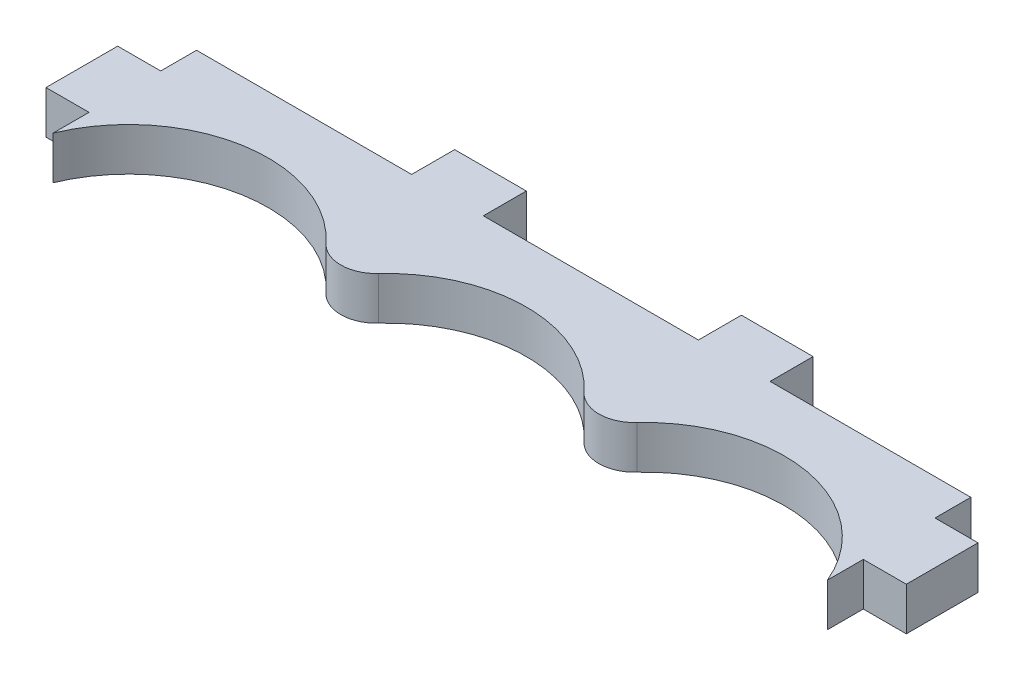
ISO-10303-21;
HEADER;
FILE_DESCRIPTION(('STEP AP214'),'2;1');
FILE_NAME('part.step','',(''),(''),'','','');
FILE_SCHEMA(('AUTOMOTIVE_DESIGN { 1 0 10303 214 1 1 1 1 }'));
ENDSEC;
DATA;
#1=APPLICATION_CONTEXT('core data for automotive mechanical design processes');
#2=APPLICATION_PROTOCOL_DEFINITION('international standard','automotive_design',2000,#1);
#3=PRODUCT_CONTEXT('',#1,'mechanical');
#4=PRODUCT('Part','Part','',(#3));
#5=PRODUCT_RELATED_PRODUCT_CATEGORY('part','',(#4));
#6=PRODUCT_DEFINITION_FORMATION('','',#4);
#7=PRODUCT_DEFINITION_CONTEXT('part definition',#1,'design');
#8=PRODUCT_DEFINITION('design','',#6,#7);
#9=PRODUCT_DEFINITION_SHAPE('','',#8);
#10=(LENGTH_UNIT() NAMED_UNIT(*) SI_UNIT(.MILLI.,.METRE.));
#11=(NAMED_UNIT(*) PLANE_ANGLE_UNIT() SI_UNIT($,.RADIAN.));
#12=(NAMED_UNIT(*) SI_UNIT($,.STERADIAN.) SOLID_ANGLE_UNIT());
#13=UNCERTAINTY_MEASURE_WITH_UNIT(LENGTH_MEASURE(1.E-05),#10,'distance_accuracy_value','');
#14=(GEOMETRIC_REPRESENTATION_CONTEXT(3) GLOBAL_UNCERTAINTY_ASSIGNED_CONTEXT((#13)) GLOBAL_UNIT_ASSIGNED_CONTEXT((#10,
#11,#12)) REPRESENTATION_CONTEXT('',''));
#15=CARTESIAN_POINT('',(0.,0.,0.));
#16=DIRECTION('',(0.,0.,1.));
#17=DIRECTION('',(1.,0.,0.));
#18=AXIS2_PLACEMENT_3D('',#15,#16,#17);
#19=CARTESIAN_POINT('',(0.,6.,0.));
#20=DIRECTION('',(1.,0.,0.));
#21=DIRECTION('',(0.,0.,-1.));
#22=AXIS2_PLACEMENT_3D('',#19,#20,#21);
#23=PLANE('',#22);
#24=DIRECTION('',(0.,0.,1.));
#25=VECTOR('',#24,1.);
#26=CARTESIAN_POINT('',(0.,0.,0.));
#27=LINE('',#26,#25);
#28=CARTESIAN_POINT('',(0.,0.,0.));
#29=VERTEX_POINT('',#28);
#30=CARTESIAN_POINT('',(0.,0.,5.));
#31=VERTEX_POINT('',#30);
#32=EDGE_CURVE('E219',#29,#31,#27,.T.);
#33=ORIENTED_EDGE('',*,*,#32,.T.);
#34=DIRECTION('',(0.,-1.,0.));
#35=VECTOR('',#34,1.);
#36=CARTESIAN_POINT('',(0.,6.,5.));
#37=LINE('',#36,#35);
#38=CARTESIAN_POINT('',(0.,6.,5.));
#39=VERTEX_POINT('',#38);
#40=EDGE_CURVE('E200',#39,#31,#37,.T.);
#41=ORIENTED_EDGE('',*,*,#40,.F.);
#42=DIRECTION('',(0.,0.,1.));
#43=VECTOR('',#42,1.);
#44=CARTESIAN_POINT('',(0.,6.,0.));
#45=LINE('',#44,#43);
#46=CARTESIAN_POINT('',(0.,6.,0.));
#47=VERTEX_POINT('',#46);
#48=EDGE_CURVE('E207',#47,#39,#45,.T.);
#49=ORIENTED_EDGE('',*,*,#48,.F.);
#50=DIRECTION('',(0.,-1.,0.));
#51=VECTOR('',#50,1.);
#52=CARTESIAN_POINT('',(0.,6.,0.));
#53=LINE('',#52,#51);
#54=EDGE_CURVE('E295',#47,#29,#53,.T.);
#55=ORIENTED_EDGE('',*,*,#54,.T.);
#56=EDGE_LOOP('',(#33,#41,#49,#55));
#57=FACE_BOUND('',#56,.T.);
#58=ADVANCED_FACE('F33',(#57),#23,.F.);
#59=CARTESIAN_POINT('',(0.,6.,5.));
#60=DIRECTION('',(0.,0.,1.));
#61=DIRECTION('',(1.,0.,0.));
#62=AXIS2_PLACEMENT_3D('',#59,#60,#61);
#63=PLANE('',#62);
#64=DIRECTION('',(-1.,0.,0.));
#65=VECTOR('',#64,1.);
#66=CARTESIAN_POINT('',(0.,0.,5.));
#67=LINE('',#66,#65);
#68=CARTESIAN_POINT('',(-6.00000000000001,0.,5.));
#69=VERTEX_POINT('',#68);
#70=EDGE_CURVE('E357',#31,#69,#67,.T.);
#71=ORIENTED_EDGE('',*,*,#70,.T.);
#72=DIRECTION('',(0.,-1.,0.));
#73=VECTOR('',#72,1.);
#74=CARTESIAN_POINT('',(-6.00000000000001,6.,5.));
#75=LINE('',#74,#73);
#76=CARTESIAN_POINT('',(-6.00000000000001,6.,5.));
#77=VERTEX_POINT('',#76);
#78=EDGE_CURVE('E203',#77,#69,#75,.T.);
#79=ORIENTED_EDGE('',*,*,#78,.F.);
#80=DIRECTION('',(-1.,0.,0.));
#81=VECTOR('',#80,1.);
#82=CARTESIAN_POINT('',(0.,6.,5.));
#83=LINE('',#82,#81);
#84=EDGE_CURVE('E196',#39,#77,#83,.T.);
#85=ORIENTED_EDGE('',*,*,#84,.F.);
#86=ORIENTED_EDGE('',*,*,#40,.T.);
#87=EDGE_LOOP('',(#71,#79,#85,#86));
#88=FACE_BOUND('',#87,.T.);
#89=ADVANCED_FACE('F198',(#88),#63,.F.);
#90=CARTESIAN_POINT('',(-6.00000000000001,6.,5.));
#91=DIRECTION('',(1.,0.,0.));
#92=DIRECTION('',(0.,0.,-1.));
#93=AXIS2_PLACEMENT_3D('',#90,#91,#92);
#94=PLANE('',#93);
#95=DIRECTION('',(0.,0.,1.));
#96=VECTOR('',#95,1.);
#97=CARTESIAN_POINT('',(-6.00000000000001,0.,5.));
#98=LINE('',#97,#96);
#99=CARTESIAN_POINT('',(-6.00000000000001,0.,15.));
#100=VERTEX_POINT('',#99);
#101=EDGE_CURVE('E354',#69,#100,#98,.T.);
#102=ORIENTED_EDGE('',*,*,#101,.T.);
#103=DIRECTION('',(0.,-1.,0.));
#104=VECTOR('',#103,1.);
#105=CARTESIAN_POINT('',(-6.00000000000001,6.,15.));
#106=LINE('',#105,#104);
#107=CARTESIAN_POINT('',(-6.00000000000001,6.,15.));
#108=VERTEX_POINT('',#107);
#109=EDGE_CURVE('E225',#108,#100,#106,.T.);
#110=ORIENTED_EDGE('',*,*,#109,.F.);
#111=DIRECTION('',(0.,0.,1.));
#112=VECTOR('',#111,1.);
#113=CARTESIAN_POINT('',(-6.00000000000001,6.,5.));
#114=LINE('',#113,#112);
#115=EDGE_CURVE('E206',#77,#108,#114,.T.);
#116=ORIENTED_EDGE('',*,*,#115,.F.);
#117=ORIENTED_EDGE('',*,*,#78,.T.);
#118=EDGE_LOOP('',(#102,#110,#116,#117));
#119=FACE_BOUND('',#118,.T.);
#120=ADVANCED_FACE('F394',(#119),#94,.F.);
#121=CARTESIAN_POINT('',(-6.00000000000001,6.,15.));
#122=DIRECTION('',(0.,0.,-1.));
#123=DIRECTION('',(-1.,0.,0.));
#124=AXIS2_PLACEMENT_3D('',#121,#122,#123);
#125=PLANE('',#124);
#126=DIRECTION('',(1.,0.,0.));
#127=VECTOR('',#126,1.);
#128=CARTESIAN_POINT('',(-6.00000000000001,0.,15.));
#129=LINE('',#128,#127);
#130=CARTESIAN_POINT('',(0.,0.,15.));
#131=VERTEX_POINT('',#130);
#132=EDGE_CURVE('E349',#100,#131,#129,.T.);
#133=ORIENTED_EDGE('',*,*,#132,.T.);
#134=DIRECTION('',(0.,-1.,0.));
#135=VECTOR('',#134,1.);
#136=CARTESIAN_POINT('',(0.,6.,15.));
#137=LINE('',#136,#135);
#138=CARTESIAN_POINT('',(0.,6.,15.));
#139=VERTEX_POINT('',#138);
#140=EDGE_CURVE('E340',#139,#131,#137,.T.);
#141=ORIENTED_EDGE('',*,*,#140,.F.);
#142=DIRECTION('',(1.,0.,0.));
#143=VECTOR('',#142,1.);
#144=CARTESIAN_POINT('',(-6.00000000000001,6.,15.));
#145=LINE('',#144,#143);
#146=EDGE_CURVE('E350',#108,#139,#145,.T.);
#147=ORIENTED_EDGE('',*,*,#146,.F.);
#148=ORIENTED_EDGE('',*,*,#109,.T.);
#149=EDGE_LOOP('',(#133,#141,#147,#148));
#150=FACE_BOUND('',#149,.T.);
#151=ADVANCED_FACE('F347',(#150),#125,.F.);
#152=CARTESIAN_POINT('',(0.,6.,15.));
#153=DIRECTION('',(1.,0.,0.));
#154=DIRECTION('',(0.,0.,-1.));
#155=AXIS2_PLACEMENT_3D('',#152,#153,#154);
#156=PLANE('',#155);
#157=DIRECTION('',(0.,0.,1.));
#158=VECTOR('',#157,1.);
#159=CARTESIAN_POINT('',(0.,0.,15.));
#160=LINE('',#159,#158);
#161=CARTESIAN_POINT('',(0.,0.,20.));
#162=VERTEX_POINT('',#161);
#163=EDGE_CURVE('E265',#131,#162,#160,.T.);
#164=ORIENTED_EDGE('',*,*,#163,.T.);
#165=DIRECTION('',(0.,-1.,0.));
#166=VECTOR('',#165,1.);
#167=CARTESIAN_POINT('',(0.,6.,20.));
#168=LINE('',#167,#166);
#169=CARTESIAN_POINT('',(0.,6.,20.));
#170=VERTEX_POINT('',#169);
#171=EDGE_CURVE('E337',#170,#162,#168,.T.);
#172=ORIENTED_EDGE('',*,*,#171,.F.);
#173=DIRECTION('',(0.,0.,1.));
#174=VECTOR('',#173,1.);
#175=CARTESIAN_POINT('',(0.,6.,15.));
#176=LINE('',#175,#174);
#177=EDGE_CURVE('E391',#139,#170,#176,.T.);
#178=ORIENTED_EDGE('',*,*,#177,.F.);
#179=ORIENTED_EDGE('',*,*,#140,.T.);
#180=EDGE_LOOP('',(#164,#172,#178,#179));
#181=FACE_BOUND('',#180,.T.);
#182=ADVANCED_FACE('F401',(#181),#156,.F.);
#183=CARTESIAN_POINT('',(18.,6.,27.5));
#184=DIRECTION('',(0.,-1.,0.));
#185=DIRECTION('',(0.,0.,-1.));
#186=AXIS2_PLACEMENT_3D('',#183,#184,#185);
#187=CYLINDRICAL_SURFACE('',#186,19.5);
#188=CARTESIAN_POINT('',(18.,0.,27.5));
#189=DIRECTION('',(0.,-1.,0.));
#190=DIRECTION('',(0.,0.,-1.));
#191=AXIS2_PLACEMENT_3D('',#188,#189,#190);
#192=CIRCLE('',#191,19.5);
#193=CARTESIAN_POINT('',(32.3265306122449,0.,14.271223767241));
#194=VERTEX_POINT('',#193);
#195=EDGE_CURVE('E261',#162,#194,#192,.T.);
#196=ORIENTED_EDGE('',*,*,#195,.T.);
#197=DIRECTION('',(0.,-1.,0.));
#198=VECTOR('',#197,1.);
#199=CARTESIAN_POINT('',(32.3265306122449,6.,14.271223767241));
#200=LINE('',#199,#198);
#201=CARTESIAN_POINT('',(32.3265306122449,6.,14.271223767241));
#202=VERTEX_POINT('',#201);
#203=EDGE_CURVE('E11',#194,#202,#200,.F.);
#204=ORIENTED_EDGE('',*,*,#203,.T.);
#205=CARTESIAN_POINT('',(18.,6.,27.5));
#206=DIRECTION('',(0.,-1.,0.));
#207=DIRECTION('',(0.,0.,-1.));
#208=AXIS2_PLACEMENT_3D('',#205,#206,#207);
#209=CIRCLE('',#208,19.5);
#210=EDGE_CURVE('E389',#170,#202,#209,.T.);
#211=ORIENTED_EDGE('',*,*,#210,.F.);
#212=ORIENTED_EDGE('',*,*,#171,.T.);
#213=EDGE_LOOP('',(#196,#204,#211,#212));
#214=FACE_BOUND('',#213,.T.);
#215=ADVANCED_FACE('F480',(#214),#187,.F.);
#216=CARTESIAN_POINT('',(54.,6.,27.5));
#217=DIRECTION('',(0.,-1.,0.));
#218=DIRECTION('',(0.,0.,-1.));
#219=AXIS2_PLACEMENT_3D('',#216,#217,#218);
#220=CYLINDRICAL_SURFACE('',#219,19.5);
#221=CARTESIAN_POINT('',(54.,0.,27.5));
#222=DIRECTION('',(0.,-1.,0.));
#223=DIRECTION('',(0.,0.,-1.));
#224=AXIS2_PLACEMENT_3D('',#221,#222,#223);
#225=CIRCLE('',#224,19.5);
#226=CARTESIAN_POINT('',(39.6734693877551,0.,14.271223767241));
#227=VERTEX_POINT('',#226);
#228=CARTESIAN_POINT('',(68.3265306122449,0.,14.271223767241));
#229=VERTEX_POINT('',#228);
#230=EDGE_CURVE('E256',#227,#229,#225,.T.);
#231=ORIENTED_EDGE('',*,*,#230,.T.);
#232=DIRECTION('',(0.,-1.,0.));
#233=VECTOR('',#232,1.);
#234=CARTESIAN_POINT('',(68.3265306122449,6.,14.271223767241));
#235=LINE('',#234,#233);
#236=CARTESIAN_POINT('',(68.3265306122449,6.,14.271223767241));
#237=VERTEX_POINT('',#236);
#238=EDGE_CURVE('E54',#229,#237,#235,.F.);
#239=ORIENTED_EDGE('',*,*,#238,.T.);
#240=CARTESIAN_POINT('',(54.,6.,27.5));
#241=DIRECTION('',(0.,-1.,0.));
#242=DIRECTION('',(0.,0.,-1.));
#243=AXIS2_PLACEMENT_3D('',#240,#241,#242);
#244=CIRCLE('',#243,19.5);
#245=CARTESIAN_POINT('',(39.6734693877551,6.,14.271223767241));
#246=VERTEX_POINT('',#245);
#247=EDGE_CURVE('E241',#246,#237,#244,.T.);
#248=ORIENTED_EDGE('',*,*,#247,.F.);
#249=DIRECTION('',(0.,-1.,0.));
#250=VECTOR('',#249,1.);
#251=CARTESIAN_POINT('',(39.6734693877551,6.,14.271223767241));
#252=LINE('',#251,#250);
#253=EDGE_CURVE('E232',#246,#227,#252,.T.);
#254=ORIENTED_EDGE('',*,*,#253,.T.);
#255=EDGE_LOOP('',(#231,#239,#248,#254));
#256=FACE_BOUND('',#255,.T.);
#257=ADVANCED_FACE('F259',(#256),#220,.F.);
#258=CARTESIAN_POINT('',(90.,6.,27.5));
#259=DIRECTION('',(0.,-1.,0.));
#260=DIRECTION('',(0.,0.,-1.));
#261=AXIS2_PLACEMENT_3D('',#258,#259,#260);
#262=CYLINDRICAL_SURFACE('',#261,19.5);
#263=CARTESIAN_POINT('',(90.,6.,27.5));
#264=DIRECTION('',(0.,-1.,0.));
#265=DIRECTION('',(0.,0.,-1.));
#266=AXIS2_PLACEMENT_3D('',#263,#264,#265);
#267=CIRCLE('',#266,19.5);
#268=CARTESIAN_POINT('',(75.6734693877551,6.,14.271223767241));
#269=VERTEX_POINT('',#268);
#270=CARTESIAN_POINT('',(108.,6.,20.));
#271=VERTEX_POINT('',#270);
#272=EDGE_CURVE('E239',#269,#271,#267,.T.);
#273=ORIENTED_EDGE('',*,*,#272,.F.);
#274=DIRECTION('',(0.,-1.,0.));
#275=VECTOR('',#274,1.);
#276=CARTESIAN_POINT('',(75.6734693877551,6.,14.271223767241));
#277=LINE('',#276,#275);
#278=CARTESIAN_POINT('',(75.6734693877551,0.,14.271223767241));
#279=VERTEX_POINT('',#278);
#280=EDGE_CURVE('E220',#269,#279,#277,.T.);
#281=ORIENTED_EDGE('',*,*,#280,.T.);
#282=CARTESIAN_POINT('',(90.,0.,27.5));
#283=DIRECTION('',(0.,-1.,0.));
#284=DIRECTION('',(0.,0.,-1.));
#285=AXIS2_PLACEMENT_3D('',#282,#283,#284);
#286=CIRCLE('',#285,19.5);
#287=CARTESIAN_POINT('',(108.,0.,20.));
#288=VERTEX_POINT('',#287);
#289=EDGE_CURVE('E258',#279,#288,#286,.T.);
#290=ORIENTED_EDGE('',*,*,#289,.T.);
#291=DIRECTION('',(0.,-1.,0.));
#292=VECTOR('',#291,1.);
#293=CARTESIAN_POINT('',(108.,6.,20.));
#294=LINE('',#293,#292);
#295=EDGE_CURVE('E248',#271,#288,#294,.T.);
#296=ORIENTED_EDGE('',*,*,#295,.F.);
#297=EDGE_LOOP('',(#273,#281,#290,#296));
#298=FACE_BOUND('',#297,.T.);
#299=ADVANCED_FACE('F245',(#298),#262,.F.);
#300=CARTESIAN_POINT('',(108.,6.,15.));
#301=DIRECTION('',(-1.,0.,0.));
#302=DIRECTION('',(0.,0.,1.));
#303=AXIS2_PLACEMENT_3D('',#300,#301,#302);
#304=PLANE('',#303);
#305=DIRECTION('',(0.,0.,-1.));
#306=VECTOR('',#305,1.);
#307=CARTESIAN_POINT('',(108.,0.,15.));
#308=LINE('',#307,#306);
#309=CARTESIAN_POINT('',(108.,0.,15.));
#310=VERTEX_POINT('',#309);
#311=EDGE_CURVE('E263',#288,#310,#308,.T.);
#312=ORIENTED_EDGE('',*,*,#311,.T.);
#313=DIRECTION('',(0.,-1.,0.));
#314=VECTOR('',#313,1.);
#315=CARTESIAN_POINT('',(108.,6.,15.));
#316=LINE('',#315,#314);
#317=CARTESIAN_POINT('',(108.,6.,15.));
#318=VERTEX_POINT('',#317);
#319=EDGE_CURVE('E333',#318,#310,#316,.T.);
#320=ORIENTED_EDGE('',*,*,#319,.F.);
#321=DIRECTION('',(0.,0.,-1.));
#322=VECTOR('',#321,1.);
#323=CARTESIAN_POINT('',(108.,6.,15.));
#324=LINE('',#323,#322);
#325=EDGE_CURVE('E250',#271,#318,#324,.T.);
#326=ORIENTED_EDGE('',*,*,#325,.F.);
#327=ORIENTED_EDGE('',*,*,#295,.T.);
#328=EDGE_LOOP('',(#312,#320,#326,#327));
#329=FACE_BOUND('',#328,.T.);
#330=ADVANCED_FACE('F471',(#329),#304,.F.);
#331=CARTESIAN_POINT('',(114.,6.,15.));
#332=DIRECTION('',(0.,0.,-1.));
#333=DIRECTION('',(-1.,0.,0.));
#334=AXIS2_PLACEMENT_3D('',#331,#332,#333);
#335=PLANE('',#334);
#336=DIRECTION('',(1.,0.,0.));
#337=VECTOR('',#336,1.);
#338=CARTESIAN_POINT('',(114.,0.,15.));
#339=LINE('',#338,#337);
#340=CARTESIAN_POINT('',(114.,0.,15.));
#341=VERTEX_POINT('',#340);
#342=EDGE_CURVE('E270',#310,#341,#339,.T.);
#343=ORIENTED_EDGE('',*,*,#342,.T.);
#344=DIRECTION('',(0.,-1.,0.));
#345=VECTOR('',#344,1.);
#346=CARTESIAN_POINT('',(114.,6.,15.));
#347=LINE('',#346,#345);
#348=CARTESIAN_POINT('',(114.,6.,15.));
#349=VERTEX_POINT('',#348);
#350=EDGE_CURVE('E330',#349,#341,#347,.T.);
#351=ORIENTED_EDGE('',*,*,#350,.F.);
#352=DIRECTION('',(1.,0.,0.));
#353=VECTOR('',#352,1.);
#354=CARTESIAN_POINT('',(114.,6.,15.));
#355=LINE('',#354,#353);
#356=EDGE_CURVE('E385',#318,#349,#355,.T.);
#357=ORIENTED_EDGE('',*,*,#356,.F.);
#358=ORIENTED_EDGE('',*,*,#319,.T.);
#359=EDGE_LOOP('',(#343,#351,#357,#358));
#360=FACE_BOUND('',#359,.T.);
#361=ADVANCED_FACE('F467',(#360),#335,.F.);
#362=CARTESIAN_POINT('',(114.,6.,4.99999999999998));
#363=DIRECTION('',(-1.,0.,0.));
#364=DIRECTION('',(0.,0.,1.));
#365=AXIS2_PLACEMENT_3D('',#362,#363,#364);
#366=PLANE('',#365);
#367=DIRECTION('',(0.,0.,-1.));
#368=VECTOR('',#367,1.);
#369=CARTESIAN_POINT('',(114.,0.,4.99999999999998));
#370=LINE('',#369,#368);
#371=CARTESIAN_POINT('',(114.,0.,4.99999999999998));
#372=VERTEX_POINT('',#371);
#373=EDGE_CURVE('E272',#341,#372,#370,.T.);
#374=ORIENTED_EDGE('',*,*,#373,.T.);
#375=DIRECTION('',(0.,-1.,0.));
#376=VECTOR('',#375,1.);
#377=CARTESIAN_POINT('',(114.,6.,4.99999999999998));
#378=LINE('',#377,#376);
#379=CARTESIAN_POINT('',(114.,6.,4.99999999999998));
#380=VERTEX_POINT('',#379);
#381=EDGE_CURVE('E327',#380,#372,#378,.T.);
#382=ORIENTED_EDGE('',*,*,#381,.F.);
#383=DIRECTION('',(0.,0.,-1.));
#384=VECTOR('',#383,1.);
#385=CARTESIAN_POINT('',(114.,6.,4.99999999999998));
#386=LINE('',#385,#384);
#387=EDGE_CURVE('E383',#349,#380,#386,.T.);
#388=ORIENTED_EDGE('',*,*,#387,.F.);
#389=ORIENTED_EDGE('',*,*,#350,.T.);
#390=EDGE_LOOP('',(#374,#382,#388,#389));
#391=FACE_BOUND('',#390,.T.);
#392=ADVANCED_FACE('F463',(#391),#366,.F.);
#393=CARTESIAN_POINT('',(108.,6.,4.99999999999998));
#394=DIRECTION('',(0.,0.,1.));
#395=DIRECTION('',(1.,0.,0.));
#396=AXIS2_PLACEMENT_3D('',#393,#394,#395);
#397=PLANE('',#396);
#398=DIRECTION('',(-1.,0.,0.));
#399=VECTOR('',#398,1.);
#400=CARTESIAN_POINT('',(108.,0.,4.99999999999998));
#401=LINE('',#400,#399);
#402=CARTESIAN_POINT('',(108.,0.,4.99999999999998));
#403=VERTEX_POINT('',#402);
#404=EDGE_CURVE('E274',#372,#403,#401,.T.);
#405=ORIENTED_EDGE('',*,*,#404,.T.);
#406=DIRECTION('',(0.,-1.,0.));
#407=VECTOR('',#406,1.);
#408=CARTESIAN_POINT('',(108.,6.,4.99999999999998));
#409=LINE('',#408,#407);
#410=CARTESIAN_POINT('',(108.,6.,4.99999999999998));
#411=VERTEX_POINT('',#410);
#412=EDGE_CURVE('E324',#411,#403,#409,.T.);
#413=ORIENTED_EDGE('',*,*,#412,.F.);
#414=DIRECTION('',(-1.,0.,0.));
#415=VECTOR('',#414,1.);
#416=CARTESIAN_POINT('',(108.,6.,4.99999999999998));
#417=LINE('',#416,#415);
#418=EDGE_CURVE('E381',#380,#411,#417,.T.);
#419=ORIENTED_EDGE('',*,*,#418,.F.);
#420=ORIENTED_EDGE('',*,*,#381,.T.);
#421=EDGE_LOOP('',(#405,#413,#419,#420));
#422=FACE_BOUND('',#421,.T.);
#423=ADVANCED_FACE('F459',(#422),#397,.F.);
#424=CARTESIAN_POINT('',(108.,6.,0.));
#425=DIRECTION('',(-1.,0.,0.));
#426=DIRECTION('',(0.,0.,1.));
#427=AXIS2_PLACEMENT_3D('',#424,#425,#426);
#428=PLANE('',#427);
#429=DIRECTION('',(0.,0.,-1.));
#430=VECTOR('',#429,1.);
#431=CARTESIAN_POINT('',(108.,0.,0.));
#432=LINE('',#431,#430);
#433=CARTESIAN_POINT('',(108.,0.,0.));
#434=VERTEX_POINT('',#433);
#435=EDGE_CURVE('E276',#403,#434,#432,.T.);
#436=ORIENTED_EDGE('',*,*,#435,.T.);
#437=DIRECTION('',(0.,-1.,0.));
#438=VECTOR('',#437,1.);
#439=CARTESIAN_POINT('',(108.,6.,0.));
#440=LINE('',#439,#438);
#441=CARTESIAN_POINT('',(108.,6.,0.));
#442=VERTEX_POINT('',#441);
#443=EDGE_CURVE('E321',#442,#434,#440,.T.);
#444=ORIENTED_EDGE('',*,*,#443,.F.);
#445=DIRECTION('',(0.,0.,-1.));
#446=VECTOR('',#445,1.);
#447=CARTESIAN_POINT('',(108.,6.,0.));
#448=LINE('',#447,#446);
#449=EDGE_CURVE('E379',#411,#442,#448,.T.);
#450=ORIENTED_EDGE('',*,*,#449,.F.);
#451=ORIENTED_EDGE('',*,*,#412,.T.);
#452=EDGE_LOOP('',(#436,#444,#450,#451));
#453=FACE_BOUND('',#452,.T.);
#454=ADVANCED_FACE('F455',(#453),#428,.F.);
#455=CARTESIAN_POINT('',(80.,6.,0.));
#456=DIRECTION('',(0.,0.,1.));
#457=DIRECTION('',(1.,0.,0.));
#458=AXIS2_PLACEMENT_3D('',#455,#456,#457);
#459=PLANE('',#458);
#460=DIRECTION('',(-1.,0.,0.));
#461=VECTOR('',#460,1.);
#462=CARTESIAN_POINT('',(80.,0.,0.));
#463=LINE('',#462,#461);
#464=CARTESIAN_POINT('',(80.,0.,0.));
#465=VERTEX_POINT('',#464);
#466=EDGE_CURVE('E278',#434,#465,#463,.T.);
#467=ORIENTED_EDGE('',*,*,#466,.T.);
#468=DIRECTION('',(0.,-1.,0.));
#469=VECTOR('',#468,1.);
#470=CARTESIAN_POINT('',(80.,6.,0.));
#471=LINE('',#470,#469);
#472=CARTESIAN_POINT('',(80.,6.,0.));
#473=VERTEX_POINT('',#472);
#474=EDGE_CURVE('E318',#473,#465,#471,.T.);
#475=ORIENTED_EDGE('',*,*,#474,.F.);
#476=DIRECTION('',(-1.,0.,0.));
#477=VECTOR('',#476,1.);
#478=CARTESIAN_POINT('',(80.,6.,0.));
#479=LINE('',#478,#477);
#480=EDGE_CURVE('E377',#442,#473,#479,.T.);
#481=ORIENTED_EDGE('',*,*,#480,.F.);
#482=ORIENTED_EDGE('',*,*,#443,.T.);
#483=EDGE_LOOP('',(#467,#475,#481,#482));
#484=FACE_BOUND('',#483,.T.);
#485=ADVANCED_FACE('F451',(#484),#459,.F.);
#486=CARTESIAN_POINT('',(80.,6.,-6.));
#487=DIRECTION('',(-1.,0.,0.));
#488=DIRECTION('',(0.,0.,1.));
#489=AXIS2_PLACEMENT_3D('',#486,#487,#488);
#490=PLANE('',#489);
#491=DIRECTION('',(0.,0.,-1.));
#492=VECTOR('',#491,1.);
#493=CARTESIAN_POINT('',(80.,0.,-6.));
#494=LINE('',#493,#492);
#495=CARTESIAN_POINT('',(80.,0.,-6.));
#496=VERTEX_POINT('',#495);
#497=EDGE_CURVE('E280',#465,#496,#494,.T.);
#498=ORIENTED_EDGE('',*,*,#497,.T.);
#499=DIRECTION('',(0.,-1.,0.));
#500=VECTOR('',#499,1.);
#501=CARTESIAN_POINT('',(80.,6.,-6.));
#502=LINE('',#501,#500);
#503=CARTESIAN_POINT('',(80.,6.,-6.));
#504=VERTEX_POINT('',#503);
#505=EDGE_CURVE('E315',#504,#496,#502,.T.);
#506=ORIENTED_EDGE('',*,*,#505,.F.);
#507=DIRECTION('',(0.,0.,-1.));
#508=VECTOR('',#507,1.);
#509=CARTESIAN_POINT('',(80.,6.,-6.));
#510=LINE('',#509,#508);
#511=EDGE_CURVE('E375',#473,#504,#510,.T.);
#512=ORIENTED_EDGE('',*,*,#511,.F.);
#513=ORIENTED_EDGE('',*,*,#474,.T.);
#514=EDGE_LOOP('',(#498,#506,#512,#513));
#515=FACE_BOUND('',#514,.T.);
#516=ADVANCED_FACE('F447',(#515),#490,.F.);
#517=CARTESIAN_POINT('',(70.,6.,-6.));
#518=DIRECTION('',(0.,0.,1.));
#519=DIRECTION('',(1.,0.,0.));
#520=AXIS2_PLACEMENT_3D('',#517,#518,#519);
#521=PLANE('',#520);
#522=DIRECTION('',(-1.,0.,0.));
#523=VECTOR('',#522,1.);
#524=CARTESIAN_POINT('',(70.,0.,-6.));
#525=LINE('',#524,#523);
#526=CARTESIAN_POINT('',(70.,0.,-6.));
#527=VERTEX_POINT('',#526);
#528=EDGE_CURVE('E282',#496,#527,#525,.T.);
#529=ORIENTED_EDGE('',*,*,#528,.T.);
#530=DIRECTION('',(0.,-1.,0.));
#531=VECTOR('',#530,1.);
#532=CARTESIAN_POINT('',(70.,6.,-6.));
#533=LINE('',#532,#531);
#534=CARTESIAN_POINT('',(70.,6.,-6.));
#535=VERTEX_POINT('',#534);
#536=EDGE_CURVE('E312',#535,#527,#533,.T.);
#537=ORIENTED_EDGE('',*,*,#536,.F.);
#538=DIRECTION('',(-1.,0.,0.));
#539=VECTOR('',#538,1.);
#540=CARTESIAN_POINT('',(70.,6.,-6.));
#541=LINE('',#540,#539);
#542=EDGE_CURVE('E373',#504,#535,#541,.T.);
#543=ORIENTED_EDGE('',*,*,#542,.F.);
#544=ORIENTED_EDGE('',*,*,#505,.T.);
#545=EDGE_LOOP('',(#529,#537,#543,#544));
#546=FACE_BOUND('',#545,.T.);
#547=ADVANCED_FACE('F443',(#546),#521,.F.);
#548=CARTESIAN_POINT('',(70.,6.,0.));
#549=DIRECTION('',(1.,0.,0.));
#550=DIRECTION('',(0.,0.,-1.));
#551=AXIS2_PLACEMENT_3D('',#548,#549,#550);
#552=PLANE('',#551);
#553=DIRECTION('',(0.,0.,1.));
#554=VECTOR('',#553,1.);
#555=CARTESIAN_POINT('',(70.,0.,0.));
#556=LINE('',#555,#554);
#557=CARTESIAN_POINT('',(70.,0.,0.));
#558=VERTEX_POINT('',#557);
#559=EDGE_CURVE('E284',#527,#558,#556,.T.);
#560=ORIENTED_EDGE('',*,*,#559,.T.);
#561=DIRECTION('',(0.,-1.,0.));
#562=VECTOR('',#561,1.);
#563=CARTESIAN_POINT('',(70.,6.,0.));
#564=LINE('',#563,#562);
#565=CARTESIAN_POINT('',(70.,6.,0.));
#566=VERTEX_POINT('',#565);
#567=EDGE_CURVE('E309',#566,#558,#564,.T.);
#568=ORIENTED_EDGE('',*,*,#567,.F.);
#569=DIRECTION('',(0.,0.,1.));
#570=VECTOR('',#569,1.);
#571=CARTESIAN_POINT('',(70.,6.,0.));
#572=LINE('',#571,#570);
#573=EDGE_CURVE('E371',#535,#566,#572,.T.);
#574=ORIENTED_EDGE('',*,*,#573,.F.);
#575=ORIENTED_EDGE('',*,*,#536,.T.);
#576=EDGE_LOOP('',(#560,#568,#574,#575));
#577=FACE_BOUND('',#576,.T.);
#578=ADVANCED_FACE('F439',(#577),#552,.F.);
#579=CARTESIAN_POINT('',(40.,6.,0.));
#580=DIRECTION('',(0.,0.,1.));
#581=DIRECTION('',(1.,0.,0.));
#582=AXIS2_PLACEMENT_3D('',#579,#580,#581);
#583=PLANE('',#582);
#584=DIRECTION('',(-1.,0.,0.));
#585=VECTOR('',#584,1.);
#586=CARTESIAN_POINT('',(40.,0.,0.));
#587=LINE('',#586,#585);
#588=CARTESIAN_POINT('',(40.,0.,0.));
#589=VERTEX_POINT('',#588);
#590=EDGE_CURVE('E286',#558,#589,#587,.T.);
#591=ORIENTED_EDGE('',*,*,#590,.T.);
#592=DIRECTION('',(0.,-1.,0.));
#593=VECTOR('',#592,1.);
#594=CARTESIAN_POINT('',(40.,6.,0.));
#595=LINE('',#594,#593);
#596=CARTESIAN_POINT('',(40.,6.,0.));
#597=VERTEX_POINT('',#596);
#598=EDGE_CURVE('E306',#597,#589,#595,.T.);
#599=ORIENTED_EDGE('',*,*,#598,.F.);
#600=DIRECTION('',(-1.,0.,0.));
#601=VECTOR('',#600,1.);
#602=CARTESIAN_POINT('',(40.,6.,0.));
#603=LINE('',#602,#601);
#604=EDGE_CURVE('E369',#566,#597,#603,.T.);
#605=ORIENTED_EDGE('',*,*,#604,.F.);
#606=ORIENTED_EDGE('',*,*,#567,.T.);
#607=EDGE_LOOP('',(#591,#599,#605,#606));
#608=FACE_BOUND('',#607,.T.);
#609=ADVANCED_FACE('F435',(#608),#583,.F.);
#610=CARTESIAN_POINT('',(40.,6.,-6.));
#611=DIRECTION('',(-1.,0.,0.));
#612=DIRECTION('',(0.,0.,1.));
#613=AXIS2_PLACEMENT_3D('',#610,#611,#612);
#614=PLANE('',#613);
#615=DIRECTION('',(0.,0.,-1.));
#616=VECTOR('',#615,1.);
#617=CARTESIAN_POINT('',(40.,0.,-6.));
#618=LINE('',#617,#616);
#619=CARTESIAN_POINT('',(40.,0.,-6.));
#620=VERTEX_POINT('',#619);
#621=EDGE_CURVE('E288',#589,#620,#618,.T.);
#622=ORIENTED_EDGE('',*,*,#621,.T.);
#623=DIRECTION('',(0.,-1.,0.));
#624=VECTOR('',#623,1.);
#625=CARTESIAN_POINT('',(40.,6.,-6.));
#626=LINE('',#625,#624);
#627=CARTESIAN_POINT('',(40.,6.,-6.));
#628=VERTEX_POINT('',#627);
#629=EDGE_CURVE('E303',#628,#620,#626,.T.);
#630=ORIENTED_EDGE('',*,*,#629,.F.);
#631=DIRECTION('',(0.,0.,-1.));
#632=VECTOR('',#631,1.);
#633=CARTESIAN_POINT('',(40.,6.,-6.));
#634=LINE('',#633,#632);
#635=EDGE_CURVE('E367',#597,#628,#634,.T.);
#636=ORIENTED_EDGE('',*,*,#635,.F.);
#637=ORIENTED_EDGE('',*,*,#598,.T.);
#638=EDGE_LOOP('',(#622,#630,#636,#637));
#639=FACE_BOUND('',#638,.T.);
#640=ADVANCED_FACE('F431',(#639),#614,.F.);
#641=CARTESIAN_POINT('',(30.,6.,-6.));
#642=DIRECTION('',(0.,0.,1.));
#643=DIRECTION('',(1.,0.,0.));
#644=AXIS2_PLACEMENT_3D('',#641,#642,#643);
#645=PLANE('',#644);
#646=DIRECTION('',(-1.,0.,0.));
#647=VECTOR('',#646,1.);
#648=CARTESIAN_POINT('',(30.,0.,-6.));
#649=LINE('',#648,#647);
#650=CARTESIAN_POINT('',(30.,0.,-6.));
#651=VERTEX_POINT('',#650);
#652=EDGE_CURVE('E290',#620,#651,#649,.T.);
#653=ORIENTED_EDGE('',*,*,#652,.T.);
#654=DIRECTION('',(0.,-1.,0.));
#655=VECTOR('',#654,1.);
#656=CARTESIAN_POINT('',(30.,6.,-6.));
#657=LINE('',#656,#655);
#658=CARTESIAN_POINT('',(30.,6.,-6.));
#659=VERTEX_POINT('',#658);
#660=EDGE_CURVE('E300',#659,#651,#657,.T.);
#661=ORIENTED_EDGE('',*,*,#660,.F.);
#662=DIRECTION('',(-1.,0.,0.));
#663=VECTOR('',#662,1.);
#664=CARTESIAN_POINT('',(30.,6.,-6.));
#665=LINE('',#664,#663);
#666=EDGE_CURVE('E365',#628,#659,#665,.T.);
#667=ORIENTED_EDGE('',*,*,#666,.F.);
#668=ORIENTED_EDGE('',*,*,#629,.T.);
#669=EDGE_LOOP('',(#653,#661,#667,#668));
#670=FACE_BOUND('',#669,.T.);
#671=ADVANCED_FACE('F427',(#670),#645,.F.);
#672=CARTESIAN_POINT('',(30.,6.,0.));
#673=DIRECTION('',(1.,0.,0.));
#674=DIRECTION('',(0.,0.,-1.));
#675=AXIS2_PLACEMENT_3D('',#672,#673,#674);
#676=PLANE('',#675);
#677=DIRECTION('',(0.,0.,1.));
#678=VECTOR('',#677,1.);
#679=CARTESIAN_POINT('',(30.,0.,0.));
#680=LINE('',#679,#678);
#681=CARTESIAN_POINT('',(30.,0.,0.));
#682=VERTEX_POINT('',#681);
#683=EDGE_CURVE('E292',#651,#682,#680,.T.);
#684=ORIENTED_EDGE('',*,*,#683,.T.);
#685=DIRECTION('',(0.,-1.,0.));
#686=VECTOR('',#685,1.);
#687=CARTESIAN_POINT('',(30.,6.,0.));
#688=LINE('',#687,#686);
#689=CARTESIAN_POINT('',(30.,6.,0.));
#690=VERTEX_POINT('',#689);
#691=EDGE_CURVE('E297',#690,#682,#688,.T.);
#692=ORIENTED_EDGE('',*,*,#691,.F.);
#693=DIRECTION('',(0.,0.,1.));
#694=VECTOR('',#693,1.);
#695=CARTESIAN_POINT('',(30.,6.,0.));
#696=LINE('',#695,#694);
#697=EDGE_CURVE('E363',#659,#690,#696,.T.);
#698=ORIENTED_EDGE('',*,*,#697,.F.);
#699=ORIENTED_EDGE('',*,*,#660,.T.);
#700=EDGE_LOOP('',(#684,#692,#698,#699));
#701=FACE_BOUND('',#700,.T.);
#702=ADVANCED_FACE('F423',(#701),#676,.F.);
#703=CARTESIAN_POINT('',(0.,6.,0.));
#704=DIRECTION('',(0.,0.,1.));
#705=DIRECTION('',(1.,0.,0.));
#706=AXIS2_PLACEMENT_3D('',#703,#704,#705);
#707=PLANE('',#706);
#708=DIRECTION('',(-1.,0.,0.));
#709=VECTOR('',#708,1.);
#710=CARTESIAN_POINT('',(0.,0.,0.));
#711=LINE('',#710,#709);
#712=EDGE_CURVE('E216',#682,#29,#711,.T.);
#713=ORIENTED_EDGE('',*,*,#712,.T.);
#714=ORIENTED_EDGE('',*,*,#54,.F.);
#715=DIRECTION('',(-1.,0.,0.));
#716=VECTOR('',#715,1.);
#717=CARTESIAN_POINT('',(0.,6.,0.));
#718=LINE('',#717,#716);
#719=EDGE_CURVE('E212',#690,#47,#718,.T.);
#720=ORIENTED_EDGE('',*,*,#719,.F.);
#721=ORIENTED_EDGE('',*,*,#691,.T.);
#722=EDGE_LOOP('',(#713,#714,#720,#721));
#723=FACE_BOUND('',#722,.T.);
#724=ADVANCED_FACE('F418',(#723),#707,.F.);
#725=CARTESIAN_POINT('',(18.,6.,27.5));
#726=DIRECTION('',(0.,-1.,0.));
#727=DIRECTION('',(0.,0.,-1.));
#728=AXIS2_PLACEMENT_3D('',#725,#726,#727);
#729=PLANE('',#728);
#730=ORIENTED_EDGE('',*,*,#247,.T.);
#731=CARTESIAN_POINT('',(72.,6.,10.8792298614053));
#732=DIRECTION('',(0.,-1.,0.));
#733=DIRECTION('',(0.,0.,-1.));
#734=AXIS2_PLACEMENT_3D('',#731,#732,#733);
#735=CIRCLE('',#734,5.);
#736=EDGE_CURVE('E41',#237,#269,#735,.F.);
#737=ORIENTED_EDGE('',*,*,#736,.T.);
#738=ORIENTED_EDGE('',*,*,#272,.T.);
#739=ORIENTED_EDGE('',*,*,#325,.T.);
#740=ORIENTED_EDGE('',*,*,#356,.T.);
#741=ORIENTED_EDGE('',*,*,#387,.T.);
#742=ORIENTED_EDGE('',*,*,#418,.T.);
#743=ORIENTED_EDGE('',*,*,#449,.T.);
#744=ORIENTED_EDGE('',*,*,#480,.T.);
#745=ORIENTED_EDGE('',*,*,#511,.T.);
#746=ORIENTED_EDGE('',*,*,#542,.T.);
#747=ORIENTED_EDGE('',*,*,#573,.T.);
#748=ORIENTED_EDGE('',*,*,#604,.T.);
#749=ORIENTED_EDGE('',*,*,#635,.T.);
#750=ORIENTED_EDGE('',*,*,#666,.T.);
#751=ORIENTED_EDGE('',*,*,#697,.T.);
#752=ORIENTED_EDGE('',*,*,#719,.T.);
#753=ORIENTED_EDGE('',*,*,#48,.T.);
#754=ORIENTED_EDGE('',*,*,#84,.T.);
#755=ORIENTED_EDGE('',*,*,#115,.T.);
#756=ORIENTED_EDGE('',*,*,#146,.T.);
#757=ORIENTED_EDGE('',*,*,#177,.T.);
#758=ORIENTED_EDGE('',*,*,#210,.T.);
#759=CARTESIAN_POINT('',(36.,6.,10.8792298614053));
#760=DIRECTION('',(0.,-1.,0.));
#761=DIRECTION('',(0.,0.,-1.));
#762=AXIS2_PLACEMENT_3D('',#759,#760,#761);
#763=CIRCLE('',#762,5.);
#764=EDGE_CURVE('E236',#202,#246,#763,.F.);
#765=ORIENTED_EDGE('',*,*,#764,.T.);
#766=EDGE_LOOP('',(#730,#737,#738,#739,#740,#741,#742,#743,#744,#745,#746,#747,#748,#749,#750,
#751,#752,#753,#754,#755,#756,#757,#758,#765));
#767=FACE_BOUND('',#766,.T.);
#768=ADVANCED_FACE('F210',(#767),#729,.F.);
#769=CARTESIAN_POINT('',(18.,0.,27.5));
#770=DIRECTION('',(0.,-1.,0.));
#771=DIRECTION('',(0.,0.,-1.));
#772=AXIS2_PLACEMENT_3D('',#769,#770,#771);
#773=PLANE('',#772);
#774=ORIENTED_EDGE('',*,*,#289,.F.);
#775=CARTESIAN_POINT('',(72.,0.,10.8792298614053));
#776=DIRECTION('',(0.,-1.,0.));
#777=DIRECTION('',(0.,0.,-1.));
#778=AXIS2_PLACEMENT_3D('',#775,#776,#777);
#779=CIRCLE('',#778,5.);
#780=EDGE_CURVE('E230',#279,#229,#779,.T.);
#781=ORIENTED_EDGE('',*,*,#780,.T.);
#782=ORIENTED_EDGE('',*,*,#230,.F.);
#783=CARTESIAN_POINT('',(36.,0.,10.8792298614053));
#784=DIRECTION('',(0.,-1.,0.));
#785=DIRECTION('',(0.,0.,-1.));
#786=AXIS2_PLACEMENT_3D('',#783,#784,#785);
#787=CIRCLE('',#786,5.);
#788=EDGE_CURVE('E223',#227,#194,#787,.T.);
#789=ORIENTED_EDGE('',*,*,#788,.T.);
#790=ORIENTED_EDGE('',*,*,#195,.F.);
#791=ORIENTED_EDGE('',*,*,#163,.F.);
#792=ORIENTED_EDGE('',*,*,#132,.F.);
#793=ORIENTED_EDGE('',*,*,#101,.F.);
#794=ORIENTED_EDGE('',*,*,#70,.F.);
#795=ORIENTED_EDGE('',*,*,#32,.F.);
#796=ORIENTED_EDGE('',*,*,#712,.F.);
#797=ORIENTED_EDGE('',*,*,#683,.F.);
#798=ORIENTED_EDGE('',*,*,#652,.F.);
#799=ORIENTED_EDGE('',*,*,#621,.F.);
#800=ORIENTED_EDGE('',*,*,#590,.F.);
#801=ORIENTED_EDGE('',*,*,#559,.F.);
#802=ORIENTED_EDGE('',*,*,#528,.F.);
#803=ORIENTED_EDGE('',*,*,#497,.F.);
#804=ORIENTED_EDGE('',*,*,#466,.F.);
#805=ORIENTED_EDGE('',*,*,#435,.F.);
#806=ORIENTED_EDGE('',*,*,#404,.F.);
#807=ORIENTED_EDGE('',*,*,#373,.F.);
#808=ORIENTED_EDGE('',*,*,#342,.F.);
#809=ORIENTED_EDGE('',*,*,#311,.F.);
#810=EDGE_LOOP('',(#774,#781,#782,#789,#790,#791,#792,#793,#794,#795,#796,#797,#798,#799,#800,
#801,#802,#803,#804,#805,#806,#807,#808,#809));
#811=FACE_BOUND('',#810,.T.);
#812=ADVANCED_FACE('F255',(#811),#773,.T.);
#813=CARTESIAN_POINT('',(72.,6.,10.8792298614053));
#814=DIRECTION('',(0.,-1.,0.));
#815=DIRECTION('',(0.,0.,-1.));
#816=AXIS2_PLACEMENT_3D('',#813,#814,#815);
#817=CYLINDRICAL_SURFACE('',#816,5.);
#818=ORIENTED_EDGE('',*,*,#736,.F.);
#819=ORIENTED_EDGE('',*,*,#238,.F.);
#820=ORIENTED_EDGE('',*,*,#780,.F.);
#821=ORIENTED_EDGE('',*,*,#280,.F.);
#822=EDGE_LOOP('',(#818,#819,#820,#821));
#823=FACE_BOUND('',#822,.T.);
#824=ADVANCED_FACE('F252',(#823),#817,.T.);
#825=CARTESIAN_POINT('',(36.,6.,10.8792298614053));
#826=DIRECTION('',(0.,-1.,0.));
#827=DIRECTION('',(0.,0.,-1.));
#828=AXIS2_PLACEMENT_3D('',#825,#826,#827);
#829=CYLINDRICAL_SURFACE('',#828,5.);
#830=ORIENTED_EDGE('',*,*,#764,.F.);
#831=ORIENTED_EDGE('',*,*,#203,.F.);
#832=ORIENTED_EDGE('',*,*,#788,.F.);
#833=ORIENTED_EDGE('',*,*,#253,.F.);
#834=EDGE_LOOP('',(#830,#831,#832,#833));
#835=FACE_BOUND('',#834,.T.);
#836=ADVANCED_FACE('F35',(#835),#829,.T.);
#837=CLOSED_SHELL('',(#58,#89,#120,#151,#182,#215,#257,#299,#330,#361,#392,#423,#454,#485,#516,
#547,#578,#609,#640,#671,#702,#724,#768,#812,#824,#836));
#838=MANIFOLD_SOLID_BREP('B2',#837);
#839=ADVANCED_BREP_SHAPE_REPRESENTATION('',(#18,#838),#14);
#840=SHAPE_DEFINITION_REPRESENTATION(#9,#839);
ENDSEC;
END-ISO-10303-21;
